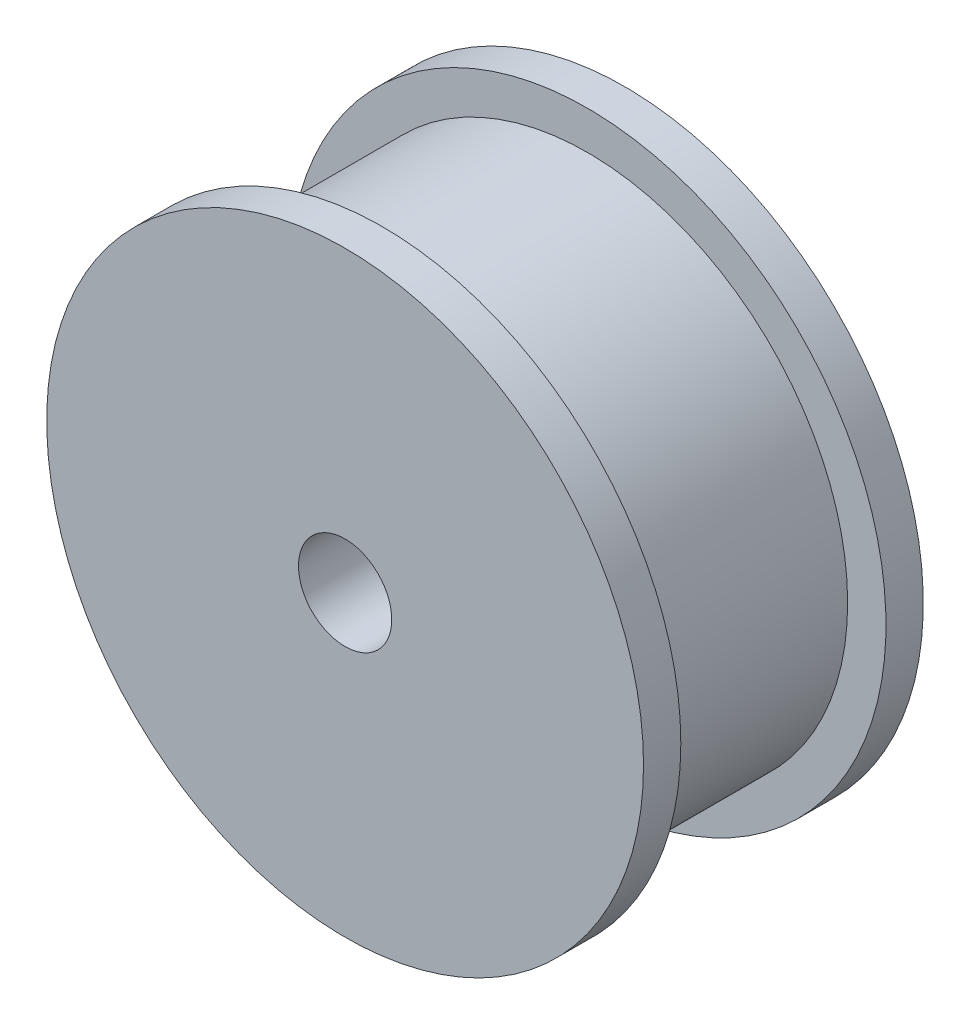
ISO-10303-21;
HEADER;
FILE_DESCRIPTION(('STEP AP214'),'2;1');
FILE_NAME('part.step','',(''),(''),'','','');
FILE_SCHEMA(('AUTOMOTIVE_DESIGN { 1 0 10303 214 1 1 1 1 }'));
ENDSEC;
DATA;
#1=APPLICATION_CONTEXT('core data for automotive mechanical design processes');
#2=APPLICATION_PROTOCOL_DEFINITION('international standard','automotive_design',2000,#1);
#3=PRODUCT_CONTEXT('',#1,'mechanical');
#4=PRODUCT('Part','Part','',(#3));
#5=PRODUCT_RELATED_PRODUCT_CATEGORY('part','',(#4));
#6=PRODUCT_DEFINITION_FORMATION('','',#4);
#7=PRODUCT_DEFINITION_CONTEXT('part definition',#1,'design');
#8=PRODUCT_DEFINITION('design','',#6,#7);
#9=PRODUCT_DEFINITION_SHAPE('','',#8);
#10=(LENGTH_UNIT() NAMED_UNIT(*) SI_UNIT(.MILLI.,.METRE.));
#11=(NAMED_UNIT(*) PLANE_ANGLE_UNIT() SI_UNIT($,.RADIAN.));
#12=(NAMED_UNIT(*) SI_UNIT($,.STERADIAN.) SOLID_ANGLE_UNIT());
#13=UNCERTAINTY_MEASURE_WITH_UNIT(LENGTH_MEASURE(1.E-05),#10,'distance_accuracy_value','');
#14=(GEOMETRIC_REPRESENTATION_CONTEXT(3) GLOBAL_UNCERTAINTY_ASSIGNED_CONTEXT((#13)) GLOBAL_UNIT_ASSIGNED_CONTEXT((#10,
#11,#12)) REPRESENTATION_CONTEXT('',''));
#15=CARTESIAN_POINT('',(0.,0.,0.));
#16=DIRECTION('',(0.,0.,1.));
#17=DIRECTION('',(1.,0.,0.));
#18=AXIS2_PLACEMENT_3D('',#15,#16,#17);
#19=CARTESIAN_POINT('',(0.,0.,5.5));
#20=DIRECTION('',(0.,0.,-1.));
#21=DIRECTION('',(-1.,0.,0.));
#22=AXIS2_PLACEMENT_3D('',#19,#20,#21);
#23=CYLINDRICAL_SURFACE('',#22,13.945);
#24=CARTESIAN_POINT('',(0.,0.,5.5));
#25=DIRECTION('',(0.,0.,1.));
#26=DIRECTION('',(1.,0.,0.));
#27=AXIS2_PLACEMENT_3D('',#24,#25,#26);
#28=CIRCLE('',#27,13.945);
#29=CARTESIAN_POINT('',(13.945,0.,5.5));
#30=VERTEX_POINT('',#29);
#31=EDGE_CURVE('E10',#30,#30,#28,.T.);
#32=ORIENTED_EDGE('',*,*,#31,.F.);
#33=EDGE_LOOP('',(#32));
#34=FACE_BOUND('',#33,.T.);
#35=CARTESIAN_POINT('',(0.,0.,-5.5));
#36=DIRECTION('',(0.,0.,1.));
#37=DIRECTION('',(1.,0.,0.));
#38=AXIS2_PLACEMENT_3D('',#35,#36,#37);
#39=CIRCLE('',#38,13.945);
#40=CARTESIAN_POINT('',(13.945,0.,-5.5));
#41=VERTEX_POINT('',#40);
#42=EDGE_CURVE('E57',#41,#41,#39,.T.);
#43=ORIENTED_EDGE('',*,*,#42,.T.);
#44=EDGE_LOOP('',(#43));
#45=FACE_BOUND('',#44,.T.);
#46=ADVANCED_FACE('F40',(#34,#45),#23,.T.);
#47=CARTESIAN_POINT('',(0.,0.,7.5));
#48=DIRECTION('',(0.,0.,-1.));
#49=DIRECTION('',(-1.,0.,0.));
#50=AXIS2_PLACEMENT_3D('',#47,#48,#49);
#51=CYLINDRICAL_SURFACE('',#50,16.);
#52=CARTESIAN_POINT('',(0.,0.,7.5));
#53=DIRECTION('',(0.,0.,1.));
#54=DIRECTION('',(1.,0.,0.));
#55=AXIS2_PLACEMENT_3D('',#52,#53,#54);
#56=CIRCLE('',#55,16.);
#57=CARTESIAN_POINT('',(16.,0.,7.5));
#58=VERTEX_POINT('',#57);
#59=EDGE_CURVE('E48',#58,#58,#56,.T.);
#60=ORIENTED_EDGE('',*,*,#59,.F.);
#61=EDGE_LOOP('',(#60));
#62=FACE_BOUND('',#61,.T.);
#63=CARTESIAN_POINT('',(0.,0.,5.5));
#64=DIRECTION('',(0.,0.,1.));
#65=DIRECTION('',(1.,0.,0.));
#66=AXIS2_PLACEMENT_3D('',#63,#64,#65);
#67=CIRCLE('',#66,16.);
#68=CARTESIAN_POINT('',(16.,0.,5.5));
#69=VERTEX_POINT('',#68);
#70=EDGE_CURVE('E54',#69,#69,#67,.T.);
#71=ORIENTED_EDGE('',*,*,#70,.T.);
#72=EDGE_LOOP('',(#71));
#73=FACE_BOUND('',#72,.T.);
#74=ADVANCED_FACE('F105',(#62,#73),#51,.T.);
#75=CARTESIAN_POINT('',(0.,0.,7.5));
#76=DIRECTION('',(0.,0.,1.));
#77=DIRECTION('',(1.,0.,0.));
#78=AXIS2_PLACEMENT_3D('',#75,#76,#77);
#79=PLANE('',#78);
#80=CARTESIAN_POINT('',(0.,0.,7.5));
#81=DIRECTION('',(0.,0.,-1.));
#82=DIRECTION('',(-1.,0.,0.));
#83=AXIS2_PLACEMENT_3D('',#80,#81,#82);
#84=CIRCLE('',#83,2.5);
#85=CARTESIAN_POINT('',(-2.5,0.,7.5));
#86=VERTEX_POINT('',#85);
#87=EDGE_CURVE('E75',#86,#86,#84,.T.);
#88=ORIENTED_EDGE('',*,*,#87,.T.);
#89=EDGE_LOOP('',(#88));
#90=FACE_BOUND('',#89,.T.);
#91=ORIENTED_EDGE('',*,*,#59,.T.);
#92=EDGE_LOOP('',(#91));
#93=FACE_BOUND('',#92,.T.);
#94=ADVANCED_FACE('F110',(#90,#93),#79,.T.);
#95=CARTESIAN_POINT('',(0.,0.,5.5));
#96=DIRECTION('',(0.,0.,1.));
#97=DIRECTION('',(1.,0.,0.));
#98=AXIS2_PLACEMENT_3D('',#95,#96,#97);
#99=PLANE('',#98);
#100=ORIENTED_EDGE('',*,*,#31,.T.);
#101=EDGE_LOOP('',(#100));
#102=FACE_BOUND('',#101,.T.);
#103=ORIENTED_EDGE('',*,*,#70,.F.);
#104=EDGE_LOOP('',(#103));
#105=FACE_BOUND('',#104,.T.);
#106=ADVANCED_FACE('F100',(#102,#105),#99,.F.);
#107=CARTESIAN_POINT('',(0.,0.,-7.5));
#108=DIRECTION('',(0.,0.,1.));
#109=DIRECTION('',(1.,0.,0.));
#110=AXIS2_PLACEMENT_3D('',#107,#108,#109);
#111=CYLINDRICAL_SURFACE('',#110,16.);
#112=CARTESIAN_POINT('',(0.,0.,-7.5));
#113=DIRECTION('',(0.,0.,-1.));
#114=DIRECTION('',(-1.,0.,0.));
#115=AXIS2_PLACEMENT_3D('',#112,#113,#114);
#116=CIRCLE('',#115,16.);
#117=CARTESIAN_POINT('',(-16.,0.,-7.5));
#118=VERTEX_POINT('',#117);
#119=EDGE_CURVE('E60',#118,#118,#116,.T.);
#120=ORIENTED_EDGE('',*,*,#119,.F.);
#121=EDGE_LOOP('',(#120));
#122=FACE_BOUND('',#121,.T.);
#123=CARTESIAN_POINT('',(0.,0.,-5.5));
#124=DIRECTION('',(0.,0.,-1.));
#125=DIRECTION('',(-1.,0.,0.));
#126=AXIS2_PLACEMENT_3D('',#123,#124,#125);
#127=CIRCLE('',#126,16.);
#128=CARTESIAN_POINT('',(-16.,0.,-5.5));
#129=VERTEX_POINT('',#128);
#130=EDGE_CURVE('E67',#129,#129,#127,.T.);
#131=ORIENTED_EDGE('',*,*,#130,.T.);
#132=EDGE_LOOP('',(#131));
#133=FACE_BOUND('',#132,.T.);
#134=ADVANCED_FACE('F90',(#122,#133),#111,.T.);
#135=CARTESIAN_POINT('',(0.,0.,-7.5));
#136=DIRECTION('',(0.,0.,-1.));
#137=DIRECTION('',(-1.,0.,0.));
#138=AXIS2_PLACEMENT_3D('',#135,#136,#137);
#139=PLANE('',#138);
#140=CARTESIAN_POINT('',(0.,0.,-7.5));
#141=DIRECTION('',(0.,0.,-1.));
#142=DIRECTION('',(-1.,0.,0.));
#143=AXIS2_PLACEMENT_3D('',#140,#141,#142);
#144=CIRCLE('',#143,2.5);
#145=CARTESIAN_POINT('',(-2.5,0.,-7.5));
#146=VERTEX_POINT('',#145);
#147=EDGE_CURVE('E43',#146,#146,#144,.T.);
#148=ORIENTED_EDGE('',*,*,#147,.F.);
#149=EDGE_LOOP('',(#148));
#150=FACE_BOUND('',#149,.T.);
#151=ORIENTED_EDGE('',*,*,#119,.T.);
#152=EDGE_LOOP('',(#151));
#153=FACE_BOUND('',#152,.T.);
#154=ADVANCED_FACE('F87',(#150,#153),#139,.T.);
#155=CARTESIAN_POINT('',(0.,0.,-5.5));
#156=DIRECTION('',(0.,0.,-1.));
#157=DIRECTION('',(-1.,0.,0.));
#158=AXIS2_PLACEMENT_3D('',#155,#156,#157);
#159=PLANE('',#158);
#160=ORIENTED_EDGE('',*,*,#42,.F.);
#161=EDGE_LOOP('',(#160));
#162=FACE_BOUND('',#161,.T.);
#163=ORIENTED_EDGE('',*,*,#130,.F.);
#164=EDGE_LOOP('',(#163));
#165=FACE_BOUND('',#164,.T.);
#166=ADVANCED_FACE('F89',(#162,#165),#159,.F.);
#167=CARTESIAN_POINT('',(0.,0.,7.5));
#168=DIRECTION('',(0.,0.,-1.));
#169=DIRECTION('',(-1.,0.,0.));
#170=AXIS2_PLACEMENT_3D('',#167,#168,#169);
#171=CYLINDRICAL_SURFACE('',#170,2.5);
#172=ORIENTED_EDGE('',*,*,#147,.T.);
#173=EDGE_LOOP('',(#172));
#174=FACE_BOUND('',#173,.T.);
#175=ORIENTED_EDGE('',*,*,#87,.F.);
#176=EDGE_LOOP('',(#175));
#177=FACE_BOUND('',#176,.T.);
#178=ADVANCED_FACE('F84',(#174,#177),#171,.F.);
#179=CLOSED_SHELL('',(#46,#74,#94,#106,#134,#154,#166,#178));
#180=MANIFOLD_SOLID_BREP('B2',#179);
#181=ADVANCED_BREP_SHAPE_REPRESENTATION('',(#18,#180),#14);
#182=SHAPE_DEFINITION_REPRESENTATION(#9,#181);
ENDSEC;
END-ISO-10303-21;
